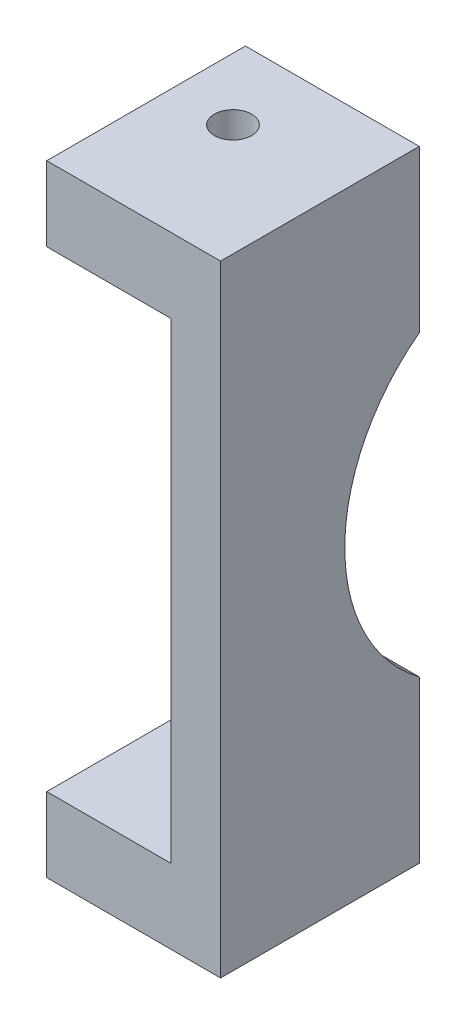
ISO-10303-21;
HEADER;
FILE_DESCRIPTION(('STEP AP214'),'2;1');
FILE_NAME('part.step','',(''),(''),'','','');
FILE_SCHEMA(('AUTOMOTIVE_DESIGN { 1 0 10303 214 1 1 1 1 }'));
ENDSEC;
DATA;
#1=APPLICATION_CONTEXT('core data for automotive mechanical design processes');
#2=APPLICATION_PROTOCOL_DEFINITION('international standard','automotive_design',2000,#1);
#3=PRODUCT_CONTEXT('',#1,'mechanical');
#4=PRODUCT('Part','Part','',(#3));
#5=PRODUCT_RELATED_PRODUCT_CATEGORY('part','',(#4));
#6=PRODUCT_DEFINITION_FORMATION('','',#4);
#7=PRODUCT_DEFINITION_CONTEXT('part definition',#1,'design');
#8=PRODUCT_DEFINITION('design','',#6,#7);
#9=PRODUCT_DEFINITION_SHAPE('','',#8);
#10=(LENGTH_UNIT() NAMED_UNIT(*) SI_UNIT(.MILLI.,.METRE.));
#11=(NAMED_UNIT(*) PLANE_ANGLE_UNIT() SI_UNIT($,.RADIAN.));
#12=(NAMED_UNIT(*) SI_UNIT($,.STERADIAN.) SOLID_ANGLE_UNIT());
#13=UNCERTAINTY_MEASURE_WITH_UNIT(LENGTH_MEASURE(1.E-05),#10,'distance_accuracy_value','');
#14=(GEOMETRIC_REPRESENTATION_CONTEXT(3) GLOBAL_UNCERTAINTY_ASSIGNED_CONTEXT((#13)) GLOBAL_UNIT_ASSIGNED_CONTEXT((#10,
#11,#12)) REPRESENTATION_CONTEXT('',''));
#15=CARTESIAN_POINT('',(0.,0.,0.));
#16=DIRECTION('',(0.,0.,1.));
#17=DIRECTION('',(1.,0.,0.));
#18=AXIS2_PLACEMENT_3D('',#15,#16,#17);
#19=CARTESIAN_POINT('',(5.,0.,-10.));
#20=DIRECTION('',(0.,1.,0.));
#21=DIRECTION('',(0.,0.,1.));
#22=AXIS2_PLACEMENT_3D('',#19,#20,#21);
#23=CYLINDRICAL_SURFACE('',#22,1.5);
#24=CARTESIAN_POINT('',(5.,6.,-10.));
#25=DIRECTION('',(0.,1.,0.));
#26=DIRECTION('',(0.,0.,1.));
#27=AXIS2_PLACEMENT_3D('',#24,#25,#26);
#28=CIRCLE('',#27,1.5);
#29=CARTESIAN_POINT('',(5.,6.,-8.5));
#30=VERTEX_POINT('',#29);
#31=EDGE_CURVE('E190',#30,#30,#28,.T.);
#32=ORIENTED_EDGE('',*,*,#31,.T.);
#33=EDGE_LOOP('',(#32));
#34=FACE_BOUND('',#33,.T.);
#35=CARTESIAN_POINT('',(5.,0.,-10.));
#36=DIRECTION('',(0.,1.,0.));
#37=DIRECTION('',(0.,0.,1.));
#38=AXIS2_PLACEMENT_3D('',#35,#36,#37);
#39=CIRCLE('',#38,1.5);
#40=CARTESIAN_POINT('',(5.,0.,-8.5));
#41=VERTEX_POINT('',#40);
#42=EDGE_CURVE('E175',#41,#41,#39,.T.);
#43=ORIENTED_EDGE('',*,*,#42,.F.);
#44=EDGE_LOOP('',(#43));
#45=FACE_BOUND('',#44,.T.);
#46=ADVANCED_FACE('F17',(#34,#45),#23,.F.);
#47=CARTESIAN_POINT('',(5.,0.,-10.));
#48=DIRECTION('',(0.,1.,0.));
#49=DIRECTION('',(0.,0.,1.));
#50=AXIS2_PLACEMENT_3D('',#47,#48,#49);
#51=CYLINDRICAL_SURFACE('',#50,1.5);
#52=CARTESIAN_POINT('',(5.,44.,-10.));
#53=DIRECTION('',(0.,1.,0.));
#54=DIRECTION('',(0.,0.,1.));
#55=AXIS2_PLACEMENT_3D('',#52,#53,#54);
#56=CIRCLE('',#55,1.5);
#57=CARTESIAN_POINT('',(5.,44.,-8.5));
#58=VERTEX_POINT('',#57);
#59=EDGE_CURVE('E20',#58,#58,#56,.F.);
#60=ORIENTED_EDGE('',*,*,#59,.T.);
#61=EDGE_LOOP('',(#60));
#62=FACE_BOUND('',#61,.T.);
#63=CARTESIAN_POINT('',(5.,50.,-10.));
#64=DIRECTION('',(0.,1.,0.));
#65=DIRECTION('',(0.,0.,1.));
#66=AXIS2_PLACEMENT_3D('',#63,#64,#65);
#67=CIRCLE('',#66,1.5);
#68=CARTESIAN_POINT('',(5.,50.,-8.5));
#69=VERTEX_POINT('',#68);
#70=EDGE_CURVE('E158',#69,#69,#67,.T.);
#71=ORIENTED_EDGE('',*,*,#70,.T.);
#72=EDGE_LOOP('',(#71));
#73=FACE_BOUND('',#72,.T.);
#74=ADVANCED_FACE('F358',(#62,#73),#51,.F.);
#75=CARTESIAN_POINT('',(0.,50.,0.));
#76=DIRECTION('',(1.,0.,0.));
#77=DIRECTION('',(0.,0.,-1.));
#78=AXIS2_PLACEMENT_3D('',#75,#76,#77);
#79=PLANE('',#78);
#80=DIRECTION('',(0.,0.,1.));
#81=VECTOR('',#80,1.);
#82=CARTESIAN_POINT('',(0.,44.,-16.));
#83=LINE('',#82,#81);
#84=CARTESIAN_POINT('',(0.,44.,-16.));
#85=VERTEX_POINT('',#84);
#86=CARTESIAN_POINT('',(0.,44.,0.));
#87=VERTEX_POINT('',#86);
#88=EDGE_CURVE('E78',#85,#87,#83,.T.);
#89=ORIENTED_EDGE('',*,*,#88,.T.);
#90=DIRECTION('',(0.,1.,0.));
#91=VECTOR('',#90,1.);
#92=CARTESIAN_POINT('',(0.,50.,0.));
#93=LINE('',#92,#91);
#94=CARTESIAN_POINT('',(0.,50.,0.));
#95=VERTEX_POINT('',#94);
#96=EDGE_CURVE('E212',#87,#95,#93,.T.);
#97=ORIENTED_EDGE('',*,*,#96,.T.);
#98=DIRECTION('',(0.,0.,-1.));
#99=VECTOR('',#98,1.);
#100=CARTESIAN_POINT('',(0.,50.,0.));
#101=LINE('',#100,#99);
#102=CARTESIAN_POINT('',(0.,50.,-16.));
#103=VERTEX_POINT('',#102);
#104=EDGE_CURVE('E146',#95,#103,#101,.T.);
#105=ORIENTED_EDGE('',*,*,#104,.T.);
#106=DIRECTION('',(0.,1.,0.));
#107=VECTOR('',#106,1.);
#108=CARTESIAN_POINT('',(0.,50.,-16.));
#109=LINE('',#108,#107);
#110=EDGE_CURVE('E145',#103,#85,#109,.F.);
#111=ORIENTED_EDGE('',*,*,#110,.T.);
#112=EDGE_LOOP('',(#89,#97,#105,#111));
#113=FACE_BOUND('',#112,.T.);
#114=ADVANCED_FACE('F255',(#113),#79,.F.);
#115=CARTESIAN_POINT('',(0.,44.,-16.));
#116=DIRECTION('',(0.,1.,0.));
#117=DIRECTION('',(0.,0.,1.));
#118=AXIS2_PLACEMENT_3D('',#115,#116,#117);
#119=PLANE('',#118);
#120=ORIENTED_EDGE('',*,*,#88,.F.);
#121=DIRECTION('',(1.,0.,0.));
#122=VECTOR('',#121,1.);
#123=CARTESIAN_POINT('',(0.,44.,-16.));
#124=LINE('',#123,#122);
#125=CARTESIAN_POINT('',(10.,44.,-16.));
#126=VERTEX_POINT('',#125);
#127=EDGE_CURVE('E194',#85,#126,#124,.T.);
#128=ORIENTED_EDGE('',*,*,#127,.T.);
#129=DIRECTION('',(0.,0.,1.));
#130=VECTOR('',#129,1.);
#131=CARTESIAN_POINT('',(10.,44.,-16.));
#132=LINE('',#131,#130);
#133=CARTESIAN_POINT('',(10.,44.,0.));
#134=VERTEX_POINT('',#133);
#135=EDGE_CURVE('E57',#126,#134,#132,.T.);
#136=ORIENTED_EDGE('',*,*,#135,.T.);
#137=DIRECTION('',(-1.,0.,0.));
#138=VECTOR('',#137,1.);
#139=CARTESIAN_POINT('',(0.,44.,0.));
#140=LINE('',#139,#138);
#141=EDGE_CURVE('E214',#134,#87,#140,.T.);
#142=ORIENTED_EDGE('',*,*,#141,.T.);
#143=EDGE_LOOP('',(#120,#128,#136,#142));
#144=FACE_BOUND('',#143,.T.);
#145=ORIENTED_EDGE('',*,*,#59,.F.);
#146=EDGE_LOOP('',(#145));
#147=FACE_BOUND('',#146,.T.);
#148=ADVANCED_FACE('F245',(#144,#147),#119,.F.);
#149=CARTESIAN_POINT('',(0.,6.,-16.));
#150=DIRECTION('',(0.,-1.,0.));
#151=DIRECTION('',(1.,0.,0.));
#152=AXIS2_PLACEMENT_3D('',#149,#150,#151);
#153=PLANE('',#152);
#154=DIRECTION('',(0.,0.,1.));
#155=VECTOR('',#154,1.);
#156=CARTESIAN_POINT('',(10.,6.,-16.));
#157=LINE('',#156,#155);
#158=CARTESIAN_POINT('',(10.,6.,0.));
#159=VERTEX_POINT('',#158);
#160=CARTESIAN_POINT('',(10.,6.,-16.));
#161=VERTEX_POINT('',#160);
#162=EDGE_CURVE('E88',#159,#161,#157,.F.);
#163=ORIENTED_EDGE('',*,*,#162,.T.);
#164=DIRECTION('',(1.,0.,0.));
#165=VECTOR('',#164,1.);
#166=CARTESIAN_POINT('',(0.,6.,-16.));
#167=LINE('',#166,#165);
#168=CARTESIAN_POINT('',(0.,6.,-16.));
#169=VERTEX_POINT('',#168);
#170=EDGE_CURVE('E117',#161,#169,#167,.F.);
#171=ORIENTED_EDGE('',*,*,#170,.T.);
#172=DIRECTION('',(0.,0.,-1.));
#173=VECTOR('',#172,1.);
#174=CARTESIAN_POINT('',(0.,6.,0.));
#175=LINE('',#174,#173);
#176=CARTESIAN_POINT('',(0.,6.,0.));
#177=VERTEX_POINT('',#176);
#178=EDGE_CURVE('E188',#169,#177,#175,.F.);
#179=ORIENTED_EDGE('',*,*,#178,.T.);
#180=DIRECTION('',(-1.,0.,0.));
#181=VECTOR('',#180,1.);
#182=CARTESIAN_POINT('',(0.,6.,0.));
#183=LINE('',#182,#181);
#184=EDGE_CURVE('E222',#177,#159,#183,.F.);
#185=ORIENTED_EDGE('',*,*,#184,.T.);
#186=EDGE_LOOP('',(#163,#171,#179,#185));
#187=FACE_BOUND('',#186,.T.);
#188=ORIENTED_EDGE('',*,*,#31,.F.);
#189=EDGE_LOOP('',(#188));
#190=FACE_BOUND('',#189,.T.);
#191=ADVANCED_FACE('F242',(#187,#190),#153,.F.);
#192=CARTESIAN_POINT('',(0.,50.,0.));
#193=DIRECTION('',(1.,0.,0.));
#194=DIRECTION('',(0.,0.,-1.));
#195=AXIS2_PLACEMENT_3D('',#192,#193,#194);
#196=PLANE('',#195);
#197=ORIENTED_EDGE('',*,*,#178,.F.);
#198=DIRECTION('',(0.,1.,0.));
#199=VECTOR('',#198,1.);
#200=CARTESIAN_POINT('',(0.,50.,-16.));
#201=LINE('',#200,#199);
#202=CARTESIAN_POINT('',(0.,0.,-16.));
#203=VERTEX_POINT('',#202);
#204=EDGE_CURVE('E129',#169,#203,#201,.F.);
#205=ORIENTED_EDGE('',*,*,#204,.T.);
#206=DIRECTION('',(0.,0.,-1.));
#207=VECTOR('',#206,1.);
#208=CARTESIAN_POINT('',(0.,0.,0.));
#209=LINE('',#208,#207);
#210=CARTESIAN_POINT('',(0.,0.,0.));
#211=VERTEX_POINT('',#210);
#212=EDGE_CURVE('E169',#211,#203,#209,.T.);
#213=ORIENTED_EDGE('',*,*,#212,.F.);
#214=DIRECTION('',(0.,1.,0.));
#215=VECTOR('',#214,1.);
#216=CARTESIAN_POINT('',(0.,50.,0.));
#217=LINE('',#216,#215);
#218=EDGE_CURVE('E168',#211,#177,#217,.T.);
#219=ORIENTED_EDGE('',*,*,#218,.T.);
#220=EDGE_LOOP('',(#197,#205,#213,#219));
#221=FACE_BOUND('',#220,.T.);
#222=ADVANCED_FACE('F244',(#221),#196,.F.);
#223=CARTESIAN_POINT('',(10.,44.,-16.));
#224=DIRECTION('',(1.,0.,0.));
#225=DIRECTION('',(0.,1.,0.));
#226=AXIS2_PLACEMENT_3D('',#223,#224,#225);
#227=PLANE('',#226);
#228=CARTESIAN_POINT('',(10.,25.,-25.));
#229=DIRECTION('',(1.,0.,0.));
#230=DIRECTION('',(0.,0.,-1.));
#231=AXIS2_PLACEMENT_3D('',#228,#229,#230);
#232=CIRCLE('',#231,15.);
#233=CARTESIAN_POINT('',(10.,37.,-16.));
#234=VERTEX_POINT('',#233);
#235=CARTESIAN_POINT('',(10.,13.,-16.));
#236=VERTEX_POINT('',#235);
#237=EDGE_CURVE('E112',#234,#236,#232,.T.);
#238=ORIENTED_EDGE('',*,*,#237,.T.);
#239=DIRECTION('',(0.,1.,0.));
#240=VECTOR('',#239,1.);
#241=CARTESIAN_POINT('',(10.,50.,-16.));
#242=LINE('',#241,#240);
#243=EDGE_CURVE('E114',#236,#161,#242,.F.);
#244=ORIENTED_EDGE('',*,*,#243,.T.);
#245=ORIENTED_EDGE('',*,*,#162,.F.);
#246=DIRECTION('',(0.,1.,0.));
#247=VECTOR('',#246,1.);
#248=CARTESIAN_POINT('',(10.,50.,0.));
#249=LINE('',#248,#247);
#250=EDGE_CURVE('E218',#159,#134,#249,.T.);
#251=ORIENTED_EDGE('',*,*,#250,.T.);
#252=ORIENTED_EDGE('',*,*,#135,.F.);
#253=DIRECTION('',(0.,1.,0.));
#254=VECTOR('',#253,1.);
#255=CARTESIAN_POINT('',(10.,50.,-16.));
#256=LINE('',#255,#254);
#257=EDGE_CURVE('E48',#126,#234,#256,.F.);
#258=ORIENTED_EDGE('',*,*,#257,.T.);
#259=EDGE_LOOP('',(#238,#244,#245,#251,#252,#258));
#260=FACE_BOUND('',#259,.T.);
#261=ADVANCED_FACE('F113',(#260),#227,.F.);
#262=CARTESIAN_POINT('',(0.,0.,0.));
#263=DIRECTION('',(0.,-1.,0.));
#264=DIRECTION('',(0.,0.,-1.));
#265=AXIS2_PLACEMENT_3D('',#262,#263,#264);
#266=PLANE('',#265);
#267=DIRECTION('',(0.,0.,1.));
#268=VECTOR('',#267,1.);
#269=CARTESIAN_POINT('',(14.,0.,0.));
#270=LINE('',#269,#268);
#271=CARTESIAN_POINT('',(14.,0.,-16.));
#272=VERTEX_POINT('',#271);
#273=CARTESIAN_POINT('',(14.,0.,0.));
#274=VERTEX_POINT('',#273);
#275=EDGE_CURVE('E110',#272,#274,#270,.T.);
#276=ORIENTED_EDGE('',*,*,#275,.T.);
#277=DIRECTION('',(-1.,0.,0.));
#278=VECTOR('',#277,1.);
#279=CARTESIAN_POINT('',(0.,0.,0.));
#280=LINE('',#279,#278);
#281=EDGE_CURVE('E165',#274,#211,#280,.T.);
#282=ORIENTED_EDGE('',*,*,#281,.T.);
#283=ORIENTED_EDGE('',*,*,#212,.T.);
#284=DIRECTION('',(1.,0.,0.));
#285=VECTOR('',#284,1.);
#286=CARTESIAN_POINT('',(0.,0.,-16.));
#287=LINE('',#286,#285);
#288=EDGE_CURVE('E127',#203,#272,#287,.T.);
#289=ORIENTED_EDGE('',*,*,#288,.T.);
#290=EDGE_LOOP('',(#276,#282,#283,#289));
#291=FACE_BOUND('',#290,.T.);
#292=ORIENTED_EDGE('',*,*,#42,.T.);
#293=EDGE_LOOP('',(#292));
#294=FACE_BOUND('',#293,.T.);
#295=ADVANCED_FACE('F278',(#291,#294),#266,.T.);
#296=CARTESIAN_POINT('',(0.,50.,0.));
#297=DIRECTION('',(0.,0.,-1.));
#298=DIRECTION('',(-1.,0.,0.));
#299=AXIS2_PLACEMENT_3D('',#296,#297,#298);
#300=PLANE('',#299);
#301=ORIENTED_EDGE('',*,*,#141,.F.);
#302=ORIENTED_EDGE('',*,*,#250,.F.);
#303=ORIENTED_EDGE('',*,*,#184,.F.);
#304=ORIENTED_EDGE('',*,*,#218,.F.);
#305=ORIENTED_EDGE('',*,*,#281,.F.);
#306=DIRECTION('',(0.,1.,0.));
#307=VECTOR('',#306,1.);
#308=CARTESIAN_POINT('',(14.,50.,0.));
#309=LINE('',#308,#307);
#310=CARTESIAN_POINT('',(14.,50.,0.));
#311=VERTEX_POINT('',#310);
#312=EDGE_CURVE('E138',#274,#311,#309,.T.);
#313=ORIENTED_EDGE('',*,*,#312,.T.);
#314=DIRECTION('',(1.,0.,0.));
#315=VECTOR('',#314,1.);
#316=CARTESIAN_POINT('',(0.,50.,0.));
#317=LINE('',#316,#315);
#318=EDGE_CURVE('E155',#311,#95,#317,.F.);
#319=ORIENTED_EDGE('',*,*,#318,.T.);
#320=ORIENTED_EDGE('',*,*,#96,.F.);
#321=EDGE_LOOP('',(#301,#302,#303,#304,#305,#313,#319,#320));
#322=FACE_BOUND('',#321,.T.);
#323=ADVANCED_FACE('F274',(#322),#300,.F.);
#324=CARTESIAN_POINT('',(0.,50.,0.));
#325=DIRECTION('',(0.,-1.,0.));
#326=DIRECTION('',(0.,0.,-1.));
#327=AXIS2_PLACEMENT_3D('',#324,#325,#326);
#328=PLANE('',#327);
#329=ORIENTED_EDGE('',*,*,#318,.F.);
#330=DIRECTION('',(0.,0.,1.));
#331=VECTOR('',#330,1.);
#332=CARTESIAN_POINT('',(14.,50.,0.));
#333=LINE('',#332,#331);
#334=CARTESIAN_POINT('',(14.,50.,-16.));
#335=VERTEX_POINT('',#334);
#336=EDGE_CURVE('E149',#311,#335,#333,.F.);
#337=ORIENTED_EDGE('',*,*,#336,.T.);
#338=DIRECTION('',(1.,0.,0.));
#339=VECTOR('',#338,1.);
#340=CARTESIAN_POINT('',(0.,50.,-16.));
#341=LINE('',#340,#339);
#342=EDGE_CURVE('E142',#335,#103,#341,.F.);
#343=ORIENTED_EDGE('',*,*,#342,.T.);
#344=ORIENTED_EDGE('',*,*,#104,.F.);
#345=EDGE_LOOP('',(#329,#337,#343,#344));
#346=FACE_BOUND('',#345,.T.);
#347=ORIENTED_EDGE('',*,*,#70,.F.);
#348=EDGE_LOOP('',(#347));
#349=FACE_BOUND('',#348,.T.);
#350=ADVANCED_FACE('F270',(#346,#349),#328,.F.);
#351=CARTESIAN_POINT('',(0.,50.,-16.));
#352=DIRECTION('',(0.,0.,1.));
#353=DIRECTION('',(1.,0.,0.));
#354=AXIS2_PLACEMENT_3D('',#351,#352,#353);
#355=PLANE('',#354);
#356=DIRECTION('',(1.,0.,0.));
#357=VECTOR('',#356,1.);
#358=CARTESIAN_POINT('',(4.,37.,-16.));
#359=LINE('',#358,#357);
#360=CARTESIAN_POINT('',(14.,37.,-16.));
#361=VERTEX_POINT('',#360);
#362=EDGE_CURVE('E118',#361,#234,#359,.F.);
#363=ORIENTED_EDGE('',*,*,#362,.T.);
#364=ORIENTED_EDGE('',*,*,#257,.F.);
#365=ORIENTED_EDGE('',*,*,#127,.F.);
#366=ORIENTED_EDGE('',*,*,#110,.F.);
#367=ORIENTED_EDGE('',*,*,#342,.F.);
#368=DIRECTION('',(0.,1.,0.));
#369=VECTOR('',#368,1.);
#370=CARTESIAN_POINT('',(14.,50.,-16.));
#371=LINE('',#370,#369);
#372=EDGE_CURVE('E152',#335,#361,#371,.F.);
#373=ORIENTED_EDGE('',*,*,#372,.T.);
#374=EDGE_LOOP('',(#363,#364,#365,#366,#367,#373));
#375=FACE_BOUND('',#374,.T.);
#376=ADVANCED_FACE('F267',(#375),#355,.F.);
#377=CARTESIAN_POINT('',(4.,25.,-25.));
#378=DIRECTION('',(1.,0.,0.));
#379=DIRECTION('',(0.,0.,-1.));
#380=AXIS2_PLACEMENT_3D('',#377,#378,#379);
#381=CYLINDRICAL_SURFACE('',#380,15.);
#382=ORIENTED_EDGE('',*,*,#362,.F.);
#383=CARTESIAN_POINT('',(14.,25.,-25.));
#384=DIRECTION('',(1.,0.,0.));
#385=DIRECTION('',(0.,0.,-1.));
#386=AXIS2_PLACEMENT_3D('',#383,#384,#385);
#387=CIRCLE('',#386,15.);
#388=CARTESIAN_POINT('',(14.,13.,-16.));
#389=VERTEX_POINT('',#388);
#390=EDGE_CURVE('E26',#361,#389,#387,.T.);
#391=ORIENTED_EDGE('',*,*,#390,.T.);
#392=DIRECTION('',(1.,0.,0.));
#393=VECTOR('',#392,1.);
#394=CARTESIAN_POINT('',(0.,13.,-16.));
#395=LINE('',#394,#393);
#396=EDGE_CURVE('E34',#389,#236,#395,.F.);
#397=ORIENTED_EDGE('',*,*,#396,.T.);
#398=ORIENTED_EDGE('',*,*,#237,.F.);
#399=EDGE_LOOP('',(#382,#391,#397,#398));
#400=FACE_BOUND('',#399,.T.);
#401=ADVANCED_FACE('F125',(#400),#381,.F.);
#402=CARTESIAN_POINT('',(0.,50.,-16.));
#403=DIRECTION('',(0.,0.,1.));
#404=DIRECTION('',(1.,0.,0.));
#405=AXIS2_PLACEMENT_3D('',#402,#403,#404);
#406=PLANE('',#405);
#407=ORIENTED_EDGE('',*,*,#396,.F.);
#408=DIRECTION('',(0.,1.,0.));
#409=VECTOR('',#408,1.);
#410=CARTESIAN_POINT('',(14.,50.,-16.));
#411=LINE('',#410,#409);
#412=EDGE_CURVE('E11',#389,#272,#411,.F.);
#413=ORIENTED_EDGE('',*,*,#412,.T.);
#414=ORIENTED_EDGE('',*,*,#288,.F.);
#415=ORIENTED_EDGE('',*,*,#204,.F.);
#416=ORIENTED_EDGE('',*,*,#170,.F.);
#417=ORIENTED_EDGE('',*,*,#243,.F.);
#418=EDGE_LOOP('',(#407,#413,#414,#415,#416,#417));
#419=FACE_BOUND('',#418,.T.);
#420=ADVANCED_FACE('F120',(#419),#406,.F.);
#421=CARTESIAN_POINT('',(14.,50.,0.));
#422=DIRECTION('',(-1.,0.,0.));
#423=DIRECTION('',(0.,0.,1.));
#424=AXIS2_PLACEMENT_3D('',#421,#422,#423);
#425=PLANE('',#424);
#426=ORIENTED_EDGE('',*,*,#390,.F.);
#427=ORIENTED_EDGE('',*,*,#372,.F.);
#428=ORIENTED_EDGE('',*,*,#336,.F.);
#429=ORIENTED_EDGE('',*,*,#312,.F.);
#430=ORIENTED_EDGE('',*,*,#275,.F.);
#431=ORIENTED_EDGE('',*,*,#412,.F.);
#432=EDGE_LOOP('',(#426,#427,#428,#429,#430,#431));
#433=FACE_BOUND('',#432,.T.);
#434=ADVANCED_FACE('F257',(#433),#425,.F.);
#435=CLOSED_SHELL('',(#46,#74,#114,#148,#191,#222,#261,#295,#323,#350,#376,#401,#420,#434));
#436=MANIFOLD_SOLID_BREP('B1',#435);
#437=ADVANCED_BREP_SHAPE_REPRESENTATION('',(#18,#436),#14);
#438=SHAPE_DEFINITION_REPRESENTATION(#9,#437);
ENDSEC;
END-ISO-10303-21;
